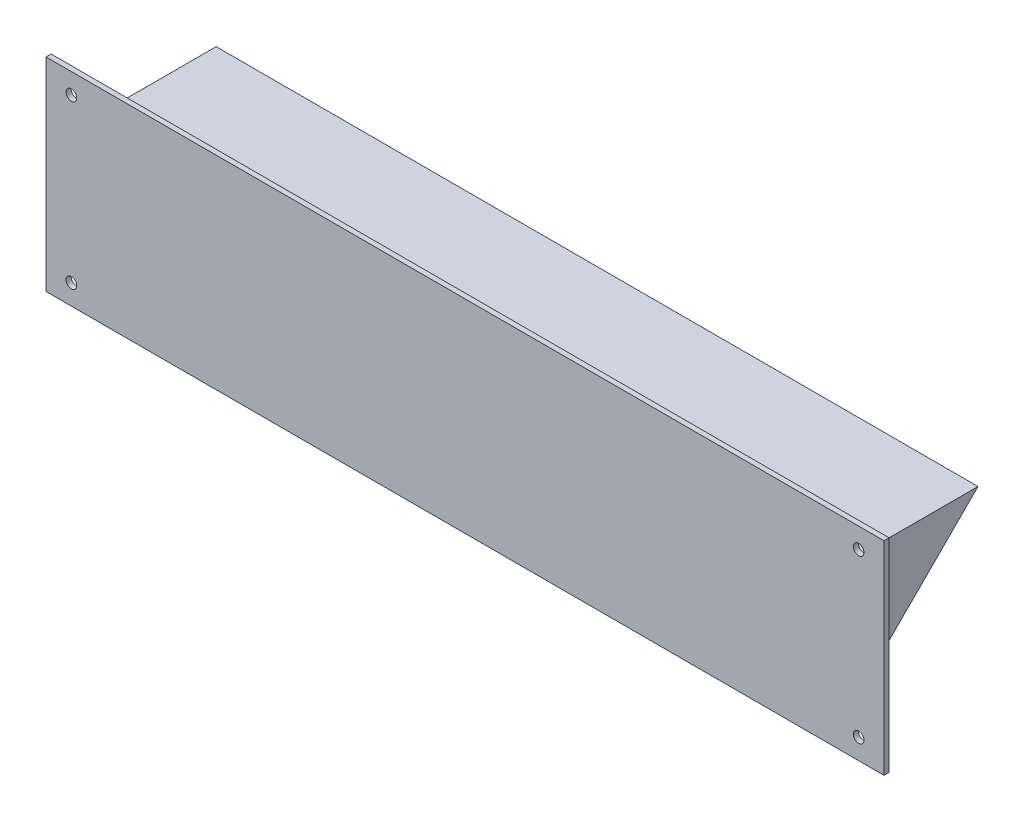
ISO-10303-21;
HEADER;
FILE_DESCRIPTION(('STEP AP214'),'2;1');
FILE_NAME('part.step','',(''),(''),'','','');
FILE_SCHEMA(('AUTOMOTIVE_DESIGN { 1 0 10303 214 1 1 1 1 }'));
ENDSEC;
DATA;
#1=APPLICATION_CONTEXT('core data for automotive mechanical design processes');
#2=APPLICATION_PROTOCOL_DEFINITION('international standard','automotive_design',2000,#1);
#3=PRODUCT_CONTEXT('',#1,'mechanical');
#4=PRODUCT('Part','Part','',(#3));
#5=PRODUCT_RELATED_PRODUCT_CATEGORY('part','',(#4));
#6=PRODUCT_DEFINITION_FORMATION('','',#4);
#7=PRODUCT_DEFINITION_CONTEXT('part definition',#1,'design');
#8=PRODUCT_DEFINITION('design','',#6,#7);
#9=PRODUCT_DEFINITION_SHAPE('','',#8);
#10=(LENGTH_UNIT() NAMED_UNIT(*) SI_UNIT(.MILLI.,.METRE.));
#11=(NAMED_UNIT(*) PLANE_ANGLE_UNIT() SI_UNIT($,.RADIAN.));
#12=(NAMED_UNIT(*) SI_UNIT($,.STERADIAN.) SOLID_ANGLE_UNIT());
#13=UNCERTAINTY_MEASURE_WITH_UNIT(LENGTH_MEASURE(1.E-05),#10,'distance_accuracy_value','');
#14=(GEOMETRIC_REPRESENTATION_CONTEXT(3) GLOBAL_UNCERTAINTY_ASSIGNED_CONTEXT((#13)) GLOBAL_UNIT_ASSIGNED_CONTEXT((#10,
#11,#12)) REPRESENTATION_CONTEXT('',''));
#15=CARTESIAN_POINT('',(0.,0.,0.));
#16=DIRECTION('',(0.,0.,1.));
#17=DIRECTION('',(1.,0.,0.));
#18=AXIS2_PLACEMENT_3D('',#15,#16,#17);
#19=CARTESIAN_POINT('',(150.,25.,-50.));
#20=DIRECTION('',(0.,0.707106781186547,0.707106781186548));
#21=DIRECTION('',(0.,-0.707106781186548,0.707106781186547));
#22=AXIS2_PLACEMENT_3D('',#19,#20,#21);
#23=PLANE('',#22);
#24=DIRECTION('',(0.,0.707106781186548,-0.707106781186547));
#25=VECTOR('',#24,1.);
#26=CARTESIAN_POINT('',(-150.,25.,-50.));
#27=LINE('',#26,#25);
#28=CARTESIAN_POINT('',(-150.,-25.,0.));
#29=VERTEX_POINT('',#28);
#30=CARTESIAN_POINT('',(-150.,25.,-50.));
#31=VERTEX_POINT('',#30);
#32=EDGE_CURVE('E224',#29,#31,#27,.T.);
#33=ORIENTED_EDGE('',*,*,#32,.T.);
#34=DIRECTION('',(-1.,0.,0.));
#35=VECTOR('',#34,1.);
#36=CARTESIAN_POINT('',(150.,25.,-50.));
#37=LINE('',#36,#35);
#38=CARTESIAN_POINT('',(150.,25.,-50.));
#39=VERTEX_POINT('',#38);
#40=EDGE_CURVE('E206',#39,#31,#37,.T.);
#41=ORIENTED_EDGE('',*,*,#40,.F.);
#42=DIRECTION('',(0.,0.707106781186548,-0.707106781186547));
#43=VECTOR('',#42,1.);
#44=CARTESIAN_POINT('',(150.,25.,-50.));
#45=LINE('',#44,#43);
#46=CARTESIAN_POINT('',(150.,-25.,0.));
#47=VERTEX_POINT('',#46);
#48=EDGE_CURVE('E219',#47,#39,#45,.T.);
#49=ORIENTED_EDGE('',*,*,#48,.F.);
#50=DIRECTION('',(-1.,0.,0.));
#51=VECTOR('',#50,1.);
#52=CARTESIAN_POINT('',(150.,-25.,0.));
#53=LINE('',#52,#51);
#54=EDGE_CURVE('E66',#47,#29,#53,.T.);
#55=ORIENTED_EDGE('',*,*,#54,.T.);
#56=EDGE_LOOP('',(#33,#41,#49,#55));
#57=FACE_BOUND('',#56,.T.);
#58=DIRECTION('',(0.,0.707106781186548,-0.707106781186547));
#59=VECTOR('',#58,1.);
#60=CARTESIAN_POINT('',(-140.,25.,-50.));
#61=LINE('',#60,#59);
#62=CARTESIAN_POINT('',(-140.,-15.,-9.99999999999999));
#63=VERTEX_POINT('',#62);
#64=CARTESIAN_POINT('',(-140.,15.,-40.));
#65=VERTEX_POINT('',#64);
#66=EDGE_CURVE('E11',#63,#65,#61,.T.);
#67=ORIENTED_EDGE('',*,*,#66,.F.);
#68=DIRECTION('',(1.,0.,0.));
#69=VECTOR('',#68,1.);
#70=CARTESIAN_POINT('',(-140.,-15.,-9.99999999999999));
#71=LINE('',#70,#69);
#72=CARTESIAN_POINT('',(140.,-15.,-9.99999999999999));
#73=VERTEX_POINT('',#72);
#74=EDGE_CURVE('E52',#63,#73,#71,.T.);
#75=ORIENTED_EDGE('',*,*,#74,.T.);
#76=DIRECTION('',(0.,0.707106781186548,-0.707106781186547));
#77=VECTOR('',#76,1.);
#78=CARTESIAN_POINT('',(140.,25.,-50.));
#79=LINE('',#78,#77);
#80=CARTESIAN_POINT('',(140.,15.,-40.));
#81=VERTEX_POINT('',#80);
#82=EDGE_CURVE('E112',#73,#81,#79,.T.);
#83=ORIENTED_EDGE('',*,*,#82,.T.);
#84=DIRECTION('',(1.,0.,0.));
#85=VECTOR('',#84,1.);
#86=CARTESIAN_POINT('',(-140.,15.,-40.));
#87=LINE('',#86,#85);
#88=EDGE_CURVE('E118',#81,#65,#87,.F.);
#89=ORIENTED_EDGE('',*,*,#88,.T.);
#90=EDGE_LOOP('',(#67,#75,#83,#89));
#91=FACE_BOUND('',#90,.T.);
#92=ADVANCED_FACE('F43',(#57,#91),#23,.F.);
#93=CARTESIAN_POINT('',(165.,40.,2.));
#94=DIRECTION('',(-1.,0.,0.));
#95=DIRECTION('',(0.,-1.,0.));
#96=AXIS2_PLACEMENT_3D('',#93,#94,#95);
#97=PLANE('',#96);
#98=DIRECTION('',(0.,1.,0.));
#99=VECTOR('',#98,1.);
#100=CARTESIAN_POINT('',(165.,40.,0.));
#101=LINE('',#100,#99);
#102=CARTESIAN_POINT('',(165.,-40.,0.));
#103=VERTEX_POINT('',#102);
#104=CARTESIAN_POINT('',(165.,40.,0.));
#105=VERTEX_POINT('',#104);
#106=EDGE_CURVE('E159',#103,#105,#101,.T.);
#107=ORIENTED_EDGE('',*,*,#106,.T.);
#108=DIRECTION('',(0.,0.,-1.));
#109=VECTOR('',#108,1.);
#110=CARTESIAN_POINT('',(165.,40.,2.));
#111=LINE('',#110,#109);
#112=CARTESIAN_POINT('',(165.,40.,2.));
#113=VERTEX_POINT('',#112);
#114=EDGE_CURVE('E119',#113,#105,#111,.T.);
#115=ORIENTED_EDGE('',*,*,#114,.F.);
#116=DIRECTION('',(0.,1.,0.));
#117=VECTOR('',#116,1.);
#118=CARTESIAN_POINT('',(165.,40.,2.));
#119=LINE('',#118,#117);
#120=CARTESIAN_POINT('',(165.,-40.,2.));
#121=VERTEX_POINT('',#120);
#122=EDGE_CURVE('E152',#121,#113,#119,.T.);
#123=ORIENTED_EDGE('',*,*,#122,.F.);
#124=DIRECTION('',(0.,0.,-1.));
#125=VECTOR('',#124,1.);
#126=CARTESIAN_POINT('',(165.,-40.,2.));
#127=LINE('',#126,#125);
#128=EDGE_CURVE('E144',#121,#103,#127,.T.);
#129=ORIENTED_EDGE('',*,*,#128,.T.);
#130=EDGE_LOOP('',(#107,#115,#123,#129));
#131=FACE_BOUND('',#130,.T.);
#132=ADVANCED_FACE('F45',(#131),#97,.F.);
#133=CARTESIAN_POINT('',(-165.,40.,2.));
#134=DIRECTION('',(0.,-1.,0.));
#135=DIRECTION('',(1.,0.,0.));
#136=AXIS2_PLACEMENT_3D('',#133,#134,#135);
#137=PLANE('',#136);
#138=DIRECTION('',(-1.,0.,0.));
#139=VECTOR('',#138,1.);
#140=CARTESIAN_POINT('',(-165.,40.,0.));
#141=LINE('',#140,#139);
#142=CARTESIAN_POINT('',(-165.,40.,0.));
#143=VERTEX_POINT('',#142);
#144=EDGE_CURVE('E156',#105,#143,#141,.T.);
#145=ORIENTED_EDGE('',*,*,#144,.T.);
#146=DIRECTION('',(0.,0.,-1.));
#147=VECTOR('',#146,1.);
#148=CARTESIAN_POINT('',(-165.,40.,2.));
#149=LINE('',#148,#147);
#150=CARTESIAN_POINT('',(-165.,40.,2.));
#151=VERTEX_POINT('',#150);
#152=EDGE_CURVE('E136',#151,#143,#149,.T.);
#153=ORIENTED_EDGE('',*,*,#152,.F.);
#154=DIRECTION('',(-1.,0.,0.));
#155=VECTOR('',#154,1.);
#156=CARTESIAN_POINT('',(-165.,40.,2.));
#157=LINE('',#156,#155);
#158=EDGE_CURVE('E169',#113,#151,#157,.T.);
#159=ORIENTED_EDGE('',*,*,#158,.F.);
#160=ORIENTED_EDGE('',*,*,#114,.T.);
#161=EDGE_LOOP('',(#145,#153,#159,#160));
#162=FACE_BOUND('',#161,.T.);
#163=ADVANCED_FACE('F255',(#162),#137,.F.);
#164=CARTESIAN_POINT('',(-165.,40.,2.));
#165=DIRECTION('',(1.,0.,0.));
#166=DIRECTION('',(0.,1.,0.));
#167=AXIS2_PLACEMENT_3D('',#164,#165,#166);
#168=PLANE('',#167);
#169=DIRECTION('',(0.,-1.,0.));
#170=VECTOR('',#169,1.);
#171=CARTESIAN_POINT('',(-165.,40.,0.));
#172=LINE('',#171,#170);
#173=CARTESIAN_POINT('',(-165.,-40.,0.));
#174=VERTEX_POINT('',#173);
#175=EDGE_CURVE('E153',#143,#174,#172,.T.);
#176=ORIENTED_EDGE('',*,*,#175,.T.);
#177=DIRECTION('',(0.,0.,-1.));
#178=VECTOR('',#177,1.);
#179=CARTESIAN_POINT('',(-165.,-40.,2.));
#180=LINE('',#179,#178);
#181=CARTESIAN_POINT('',(-165.,-40.,2.));
#182=VERTEX_POINT('',#181);
#183=EDGE_CURVE('E140',#182,#174,#180,.T.);
#184=ORIENTED_EDGE('',*,*,#183,.F.);
#185=DIRECTION('',(0.,-1.,0.));
#186=VECTOR('',#185,1.);
#187=CARTESIAN_POINT('',(-165.,40.,2.));
#188=LINE('',#187,#186);
#189=EDGE_CURVE('E166',#151,#182,#188,.T.);
#190=ORIENTED_EDGE('',*,*,#189,.F.);
#191=ORIENTED_EDGE('',*,*,#152,.T.);
#192=EDGE_LOOP('',(#176,#184,#190,#191));
#193=FACE_BOUND('',#192,.T.);
#194=ADVANCED_FACE('F287',(#193),#168,.F.);
#195=CARTESIAN_POINT('',(-165.,-40.,2.));
#196=DIRECTION('',(0.,1.,0.));
#197=DIRECTION('',(0.,0.,1.));
#198=AXIS2_PLACEMENT_3D('',#195,#196,#197);
#199=PLANE('',#198);
#200=DIRECTION('',(1.,0.,0.));
#201=VECTOR('',#200,1.);
#202=CARTESIAN_POINT('',(-165.,-40.,0.));
#203=LINE('',#202,#201);
#204=EDGE_CURVE('E149',#174,#103,#203,.T.);
#205=ORIENTED_EDGE('',*,*,#204,.T.);
#206=ORIENTED_EDGE('',*,*,#128,.F.);
#207=DIRECTION('',(1.,0.,0.));
#208=VECTOR('',#207,1.);
#209=CARTESIAN_POINT('',(-165.,-40.,2.));
#210=LINE('',#209,#208);
#211=EDGE_CURVE('E148',#182,#121,#210,.T.);
#212=ORIENTED_EDGE('',*,*,#211,.F.);
#213=ORIENTED_EDGE('',*,*,#183,.T.);
#214=EDGE_LOOP('',(#205,#206,#212,#213));
#215=FACE_BOUND('',#214,.T.);
#216=ADVANCED_FACE('F281',(#215),#199,.F.);
#217=CARTESIAN_POINT('',(0.,0.,2.));
#218=DIRECTION('',(0.,0.,1.));
#219=DIRECTION('',(1.,0.,0.));
#220=AXIS2_PLACEMENT_3D('',#217,#218,#219);
#221=PLANE('',#220);
#222=CARTESIAN_POINT('',(-155.,32.,2.));
#223=DIRECTION('',(0.,0.,1.));
#224=DIRECTION('',(1.,0.,0.));
#225=AXIS2_PLACEMENT_3D('',#222,#223,#224);
#226=CIRCLE('',#225,2.09999999999999);
#227=CARTESIAN_POINT('',(-152.9,32.,2.));
#228=VERTEX_POINT('',#227);
#229=EDGE_CURVE('E202',#228,#228,#226,.T.);
#230=ORIENTED_EDGE('',*,*,#229,.F.);
#231=EDGE_LOOP('',(#230));
#232=FACE_BOUND('',#231,.T.);
#233=CARTESIAN_POINT('',(-155.,-32.,2.));
#234=DIRECTION('',(0.,0.,1.));
#235=DIRECTION('',(1.,0.,0.));
#236=AXIS2_PLACEMENT_3D('',#233,#234,#235);
#237=CIRCLE('',#236,2.09999999999999);
#238=CARTESIAN_POINT('',(-152.9,-32.,2.));
#239=VERTEX_POINT('',#238);
#240=EDGE_CURVE('E194',#239,#239,#237,.T.);
#241=ORIENTED_EDGE('',*,*,#240,.F.);
#242=EDGE_LOOP('',(#241));
#243=FACE_BOUND('',#242,.T.);
#244=CARTESIAN_POINT('',(155.,32.,2.));
#245=DIRECTION('',(0.,0.,1.));
#246=DIRECTION('',(1.,0.,0.));
#247=AXIS2_PLACEMENT_3D('',#244,#245,#246);
#248=CIRCLE('',#247,2.09999999999999);
#249=CARTESIAN_POINT('',(157.1,32.,2.));
#250=VERTEX_POINT('',#249);
#251=EDGE_CURVE('E186',#250,#250,#248,.T.);
#252=ORIENTED_EDGE('',*,*,#251,.F.);
#253=EDGE_LOOP('',(#252));
#254=FACE_BOUND('',#253,.T.);
#255=CARTESIAN_POINT('',(155.,-32.,2.));
#256=DIRECTION('',(0.,0.,1.));
#257=DIRECTION('',(1.,0.,0.));
#258=AXIS2_PLACEMENT_3D('',#255,#256,#257);
#259=CIRCLE('',#258,2.09999999999999);
#260=CARTESIAN_POINT('',(157.1,-32.,2.));
#261=VERTEX_POINT('',#260);
#262=EDGE_CURVE('E178',#261,#261,#259,.T.);
#263=ORIENTED_EDGE('',*,*,#262,.F.);
#264=EDGE_LOOP('',(#263));
#265=FACE_BOUND('',#264,.T.);
#266=ORIENTED_EDGE('',*,*,#122,.T.);
#267=ORIENTED_EDGE('',*,*,#158,.T.);
#268=ORIENTED_EDGE('',*,*,#189,.T.);
#269=ORIENTED_EDGE('',*,*,#211,.T.);
#270=EDGE_LOOP('',(#266,#267,#268,#269));
#271=FACE_BOUND('',#270,.T.);
#272=ADVANCED_FACE('F278',(#232,#243,#254,#265,#271),#221,.T.);
#273=CARTESIAN_POINT('',(0.,0.,0.));
#274=DIRECTION('',(0.,0.,1.));
#275=DIRECTION('',(1.,0.,0.));
#276=AXIS2_PLACEMENT_3D('',#273,#274,#275);
#277=PLANE('',#276);
#278=ORIENTED_EDGE('',*,*,#54,.F.);
#279=DIRECTION('',(0.,-1.,0.));
#280=VECTOR('',#279,1.);
#281=CARTESIAN_POINT('',(150.,25.,0.));
#282=LINE('',#281,#280);
#283=CARTESIAN_POINT('',(150.,25.,0.));
#284=VERTEX_POINT('',#283);
#285=EDGE_CURVE('E215',#284,#47,#282,.T.);
#286=ORIENTED_EDGE('',*,*,#285,.F.);
#287=DIRECTION('',(-1.,0.,0.));
#288=VECTOR('',#287,1.);
#289=CARTESIAN_POINT('',(150.,25.,0.));
#290=LINE('',#289,#288);
#291=CARTESIAN_POINT('',(-150.,25.,0.));
#292=VERTEX_POINT('',#291);
#293=EDGE_CURVE('E210',#284,#292,#290,.T.);
#294=ORIENTED_EDGE('',*,*,#293,.T.);
#295=DIRECTION('',(0.,-1.,0.));
#296=VECTOR('',#295,1.);
#297=CARTESIAN_POINT('',(-150.,25.,0.));
#298=LINE('',#297,#296);
#299=EDGE_CURVE('E216',#292,#29,#298,.T.);
#300=ORIENTED_EDGE('',*,*,#299,.T.);
#301=EDGE_LOOP('',(#278,#286,#294,#300));
#302=FACE_BOUND('',#301,.T.);
#303=CARTESIAN_POINT('',(-155.,32.,0.));
#304=DIRECTION('',(0.,0.,1.));
#305=DIRECTION('',(1.,0.,0.));
#306=AXIS2_PLACEMENT_3D('',#303,#304,#305);
#307=CIRCLE('',#306,2.09999999999999);
#308=CARTESIAN_POINT('',(-152.9,32.,0.));
#309=VERTEX_POINT('',#308);
#310=EDGE_CURVE('E198',#309,#309,#307,.T.);
#311=ORIENTED_EDGE('',*,*,#310,.T.);
#312=EDGE_LOOP('',(#311));
#313=FACE_BOUND('',#312,.T.);
#314=CARTESIAN_POINT('',(-155.,-32.,0.));
#315=DIRECTION('',(0.,0.,1.));
#316=DIRECTION('',(1.,0.,0.));
#317=AXIS2_PLACEMENT_3D('',#314,#315,#316);
#318=CIRCLE('',#317,2.09999999999999);
#319=CARTESIAN_POINT('',(-152.9,-32.,0.));
#320=VERTEX_POINT('',#319);
#321=EDGE_CURVE('E190',#320,#320,#318,.T.);
#322=ORIENTED_EDGE('',*,*,#321,.T.);
#323=EDGE_LOOP('',(#322));
#324=FACE_BOUND('',#323,.T.);
#325=CARTESIAN_POINT('',(155.,32.,0.));
#326=DIRECTION('',(0.,0.,1.));
#327=DIRECTION('',(1.,0.,0.));
#328=AXIS2_PLACEMENT_3D('',#325,#326,#327);
#329=CIRCLE('',#328,2.09999999999999);
#330=CARTESIAN_POINT('',(157.1,32.,0.));
#331=VERTEX_POINT('',#330);
#332=EDGE_CURVE('E182',#331,#331,#329,.T.);
#333=ORIENTED_EDGE('',*,*,#332,.T.);
#334=EDGE_LOOP('',(#333));
#335=FACE_BOUND('',#334,.T.);
#336=CARTESIAN_POINT('',(155.,-32.,0.));
#337=DIRECTION('',(0.,0.,1.));
#338=DIRECTION('',(1.,0.,0.));
#339=AXIS2_PLACEMENT_3D('',#336,#337,#338);
#340=CIRCLE('',#339,2.09999999999999);
#341=CARTESIAN_POINT('',(157.1,-32.,0.));
#342=VERTEX_POINT('',#341);
#343=EDGE_CURVE('E163',#342,#342,#340,.T.);
#344=ORIENTED_EDGE('',*,*,#343,.T.);
#345=EDGE_LOOP('',(#344));
#346=FACE_BOUND('',#345,.T.);
#347=ORIENTED_EDGE('',*,*,#106,.F.);
#348=ORIENTED_EDGE('',*,*,#204,.F.);
#349=ORIENTED_EDGE('',*,*,#175,.F.);
#350=ORIENTED_EDGE('',*,*,#144,.F.);
#351=EDGE_LOOP('',(#347,#348,#349,#350));
#352=FACE_BOUND('',#351,.T.);
#353=ADVANCED_FACE('F276',(#302,#313,#324,#335,#346,#352),#277,.F.);
#354=CARTESIAN_POINT('',(155.,-32.,2.));
#355=DIRECTION('',(0.,0.,1.));
#356=DIRECTION('',(1.,0.,0.));
#357=AXIS2_PLACEMENT_3D('',#354,#355,#356);
#358=CYLINDRICAL_SURFACE('',#357,2.09999999999999);
#359=ORIENTED_EDGE('',*,*,#343,.F.);
#360=EDGE_LOOP('',(#359));
#361=FACE_BOUND('',#360,.T.);
#362=ORIENTED_EDGE('',*,*,#262,.T.);
#363=EDGE_LOOP('',(#362));
#364=FACE_BOUND('',#363,.T.);
#365=ADVANCED_FACE('F272',(#361,#364),#358,.F.);
#366=CARTESIAN_POINT('',(155.,32.,2.));
#367=DIRECTION('',(0.,0.,1.));
#368=DIRECTION('',(1.,0.,0.));
#369=AXIS2_PLACEMENT_3D('',#366,#367,#368);
#370=CYLINDRICAL_SURFACE('',#369,2.09999999999999);
#371=ORIENTED_EDGE('',*,*,#332,.F.);
#372=EDGE_LOOP('',(#371));
#373=FACE_BOUND('',#372,.T.);
#374=ORIENTED_EDGE('',*,*,#251,.T.);
#375=EDGE_LOOP('',(#374));
#376=FACE_BOUND('',#375,.T.);
#377=ADVANCED_FACE('F268',(#373,#376),#370,.F.);
#378=CARTESIAN_POINT('',(-155.,-32.,2.));
#379=DIRECTION('',(0.,0.,1.));
#380=DIRECTION('',(1.,0.,0.));
#381=AXIS2_PLACEMENT_3D('',#378,#379,#380);
#382=CYLINDRICAL_SURFACE('',#381,2.09999999999999);
#383=ORIENTED_EDGE('',*,*,#321,.F.);
#384=EDGE_LOOP('',(#383));
#385=FACE_BOUND('',#384,.T.);
#386=ORIENTED_EDGE('',*,*,#240,.T.);
#387=EDGE_LOOP('',(#386));
#388=FACE_BOUND('',#387,.T.);
#389=ADVANCED_FACE('F264',(#385,#388),#382,.F.);
#390=CARTESIAN_POINT('',(-155.,32.,2.));
#391=DIRECTION('',(0.,0.,1.));
#392=DIRECTION('',(1.,0.,0.));
#393=AXIS2_PLACEMENT_3D('',#390,#391,#392);
#394=CYLINDRICAL_SURFACE('',#393,2.09999999999999);
#395=ORIENTED_EDGE('',*,*,#310,.F.);
#396=EDGE_LOOP('',(#395));
#397=FACE_BOUND('',#396,.T.);
#398=ORIENTED_EDGE('',*,*,#229,.T.);
#399=EDGE_LOOP('',(#398));
#400=FACE_BOUND('',#399,.T.);
#401=ADVANCED_FACE('F261',(#397,#400),#394,.F.);
#402=CARTESIAN_POINT('',(150.,25.,0.));
#403=DIRECTION('',(0.,-1.,0.));
#404=DIRECTION('',(0.,0.,-1.));
#405=AXIS2_PLACEMENT_3D('',#402,#403,#404);
#406=PLANE('',#405);
#407=DIRECTION('',(0.,0.,1.));
#408=VECTOR('',#407,1.);
#409=CARTESIAN_POINT('',(-150.,25.,0.));
#410=LINE('',#409,#408);
#411=EDGE_CURVE('E220',#31,#292,#410,.T.);
#412=ORIENTED_EDGE('',*,*,#411,.T.);
#413=ORIENTED_EDGE('',*,*,#293,.F.);
#414=DIRECTION('',(0.,0.,1.));
#415=VECTOR('',#414,1.);
#416=CARTESIAN_POINT('',(150.,25.,0.));
#417=LINE('',#416,#415);
#418=EDGE_CURVE('E230',#39,#284,#417,.T.);
#419=ORIENTED_EDGE('',*,*,#418,.F.);
#420=ORIENTED_EDGE('',*,*,#40,.T.);
#421=EDGE_LOOP('',(#412,#413,#419,#420));
#422=FACE_BOUND('',#421,.T.);
#423=ADVANCED_FACE('F259',(#422),#406,.F.);
#424=CARTESIAN_POINT('',(150.,0.,0.));
#425=DIRECTION('',(1.,0.,0.));
#426=DIRECTION('',(0.,0.,-1.));
#427=AXIS2_PLACEMENT_3D('',#424,#425,#426);
#428=PLANE('',#427);
#429=ORIENTED_EDGE('',*,*,#48,.T.);
#430=ORIENTED_EDGE('',*,*,#418,.T.);
#431=ORIENTED_EDGE('',*,*,#285,.T.);
#432=EDGE_LOOP('',(#429,#430,#431));
#433=FACE_BOUND('',#432,.T.);
#434=ADVANCED_FACE('F349',(#433),#428,.T.);
#435=CARTESIAN_POINT('',(-150.,0.,0.));
#436=DIRECTION('',(1.,0.,0.));
#437=DIRECTION('',(0.,0.,-1.));
#438=AXIS2_PLACEMENT_3D('',#435,#436,#437);
#439=PLANE('',#438);
#440=ORIENTED_EDGE('',*,*,#32,.F.);
#441=ORIENTED_EDGE('',*,*,#299,.F.);
#442=ORIENTED_EDGE('',*,*,#411,.F.);
#443=EDGE_LOOP('',(#440,#441,#442));
#444=FACE_BOUND('',#443,.T.);
#445=ADVANCED_FACE('F247',(#444),#439,.F.);
#446=CARTESIAN_POINT('',(-140.,0.,-25.));
#447=DIRECTION('',(1.,0.,0.));
#448=DIRECTION('',(0.,0.,-1.));
#449=AXIS2_PLACEMENT_3D('',#446,#447,#448);
#450=CYLINDRICAL_SURFACE('',#449,21.2132034355964);
#451=CARTESIAN_POINT('',(-140.,0.,-25.));
#452=DIRECTION('',(1.,0.,0.));
#453=DIRECTION('',(0.,0.,-1.));
#454=AXIS2_PLACEMENT_3D('',#451,#452,#453);
#455=CIRCLE('',#454,21.2132034355964);
#456=EDGE_CURVE('E126',#65,#63,#455,.T.);
#457=ORIENTED_EDGE('',*,*,#456,.F.);
#458=ORIENTED_EDGE('',*,*,#88,.F.);
#459=CARTESIAN_POINT('',(140.,0.,-25.));
#460=DIRECTION('',(1.,0.,0.));
#461=DIRECTION('',(0.,0.,-1.));
#462=AXIS2_PLACEMENT_3D('',#459,#460,#461);
#463=CIRCLE('',#462,21.2132034355964);
#464=EDGE_CURVE('E58',#81,#73,#463,.T.);
#465=ORIENTED_EDGE('',*,*,#464,.T.);
#466=ORIENTED_EDGE('',*,*,#74,.F.);
#467=EDGE_LOOP('',(#457,#458,#465,#466));
#468=FACE_BOUND('',#467,.T.);
#469=ADVANCED_FACE('F123',(#468),#450,.F.);
#470=CARTESIAN_POINT('',(-140.,0.,-25.));
#471=DIRECTION('',(1.,0.,0.));
#472=DIRECTION('',(0.,0.,-1.));
#473=AXIS2_PLACEMENT_3D('',#470,#471,#472);
#474=PLANE('',#473);
#475=ORIENTED_EDGE('',*,*,#66,.T.);
#476=ORIENTED_EDGE('',*,*,#456,.T.);
#477=EDGE_LOOP('',(#475,#476));
#478=FACE_BOUND('',#477,.T.);
#479=ADVANCED_FACE('F239',(#478),#474,.T.);
#480=CARTESIAN_POINT('',(140.,0.,-25.));
#481=DIRECTION('',(1.,0.,0.));
#482=DIRECTION('',(0.,0.,-1.));
#483=AXIS2_PLACEMENT_3D('',#480,#481,#482);
#484=PLANE('',#483);
#485=ORIENTED_EDGE('',*,*,#464,.F.);
#486=ORIENTED_EDGE('',*,*,#82,.F.);
#487=EDGE_LOOP('',(#485,#486));
#488=FACE_BOUND('',#487,.T.);
#489=ADVANCED_FACE('F113',(#488),#484,.F.);
#490=CLOSED_SHELL('',(#92,#132,#163,#194,#216,#272,#353,#365,#377,#389,#401,#423,#434,#445,#469,
#479,#489));
#491=MANIFOLD_SOLID_BREP('B2',#490);
#492=ADVANCED_BREP_SHAPE_REPRESENTATION('',(#18,#491),#14);
#493=SHAPE_DEFINITION_REPRESENTATION(#9,#492);
ENDSEC;
END-ISO-10303-21;
